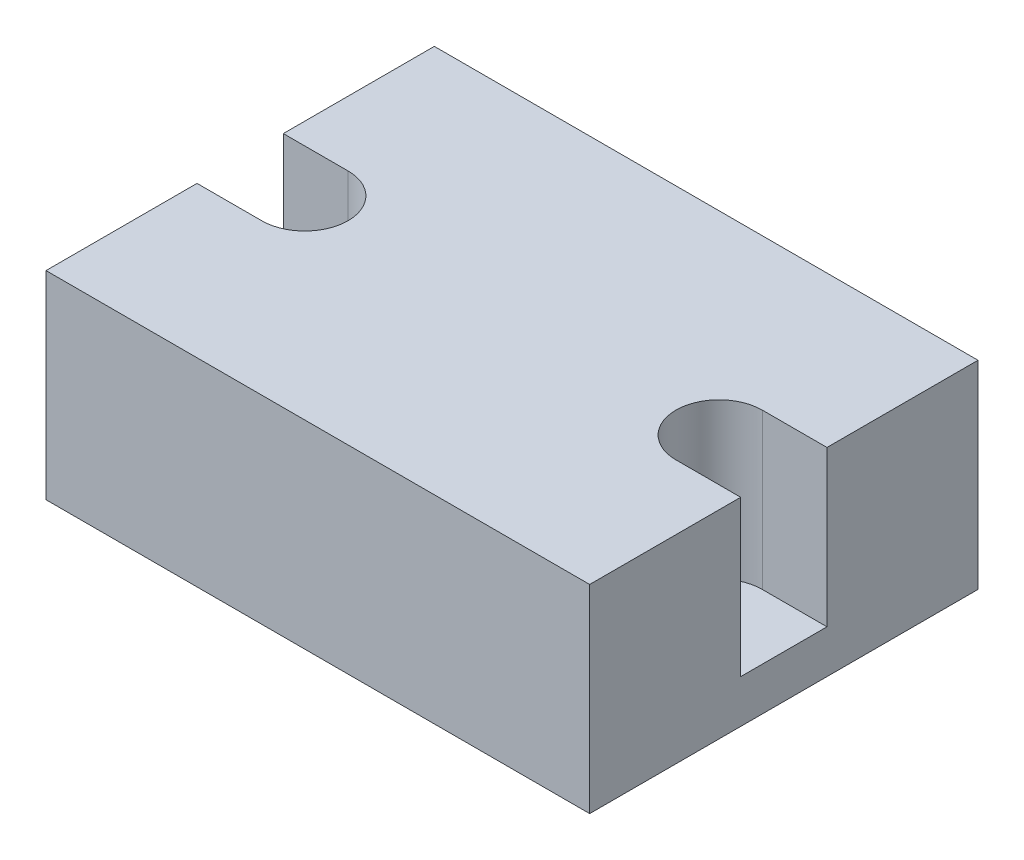
ISO-10303-21;
HEADER;
FILE_DESCRIPTION(('STEP AP214'),'2;1');
FILE_NAME('part.step','',(''),(''),'','','');
FILE_SCHEMA(('AUTOMOTIVE_DESIGN { 1 0 10303 214 1 1 1 1 }'));
ENDSEC;
DATA;
#1=APPLICATION_CONTEXT('core data for automotive mechanical design processes');
#2=APPLICATION_PROTOCOL_DEFINITION('international standard','automotive_design',2000,#1);
#3=PRODUCT_CONTEXT('',#1,'mechanical');
#4=PRODUCT('Part','Part','',(#3));
#5=PRODUCT_RELATED_PRODUCT_CATEGORY('part','',(#4));
#6=PRODUCT_DEFINITION_FORMATION('','',#4);
#7=PRODUCT_DEFINITION_CONTEXT('part definition',#1,'design');
#8=PRODUCT_DEFINITION('design','',#6,#7);
#9=PRODUCT_DEFINITION_SHAPE('','',#8);
#10=(LENGTH_UNIT() NAMED_UNIT(*) SI_UNIT(.MILLI.,.METRE.));
#11=(NAMED_UNIT(*) PLANE_ANGLE_UNIT() SI_UNIT($,.RADIAN.));
#12=(NAMED_UNIT(*) SI_UNIT($,.STERADIAN.) SOLID_ANGLE_UNIT());
#13=UNCERTAINTY_MEASURE_WITH_UNIT(LENGTH_MEASURE(1.E-05),#10,'distance_accuracy_value','');
#14=(GEOMETRIC_REPRESENTATION_CONTEXT(3) GLOBAL_UNCERTAINTY_ASSIGNED_CONTEXT((#13)) GLOBAL_UNIT_ASSIGNED_CONTEXT((#10,
#11,#12)) REPRESENTATION_CONTEXT('',''));
#15=CARTESIAN_POINT('',(0.,0.,0.));
#16=DIRECTION('',(0.,0.,1.));
#17=DIRECTION('',(1.,0.,0.));
#18=AXIS2_PLACEMENT_3D('',#15,#16,#17);
#19=CARTESIAN_POINT('',(31.5,23.,22.5));
#20=DIRECTION('',(-1.,0.,0.));
#21=DIRECTION('',(0.,0.,1.));
#22=AXIS2_PLACEMENT_3D('',#19,#20,#21);
#23=PLANE('',#22);
#24=DIRECTION('',(0.,0.,1.));
#25=VECTOR('',#24,1.);
#26=CARTESIAN_POINT('',(31.5,5.,22.5));
#27=LINE('',#26,#25);
#28=CARTESIAN_POINT('',(31.5,5.,-5.));
#29=VERTEX_POINT('',#28);
#30=CARTESIAN_POINT('',(31.5,5.,5.));
#31=VERTEX_POINT('',#30);
#32=EDGE_CURVE('E12',#29,#31,#27,.T.);
#33=ORIENTED_EDGE('',*,*,#32,.T.);
#34=DIRECTION('',(0.,1.,0.));
#35=VECTOR('',#34,1.);
#36=CARTESIAN_POINT('',(31.5,23.,5.));
#37=LINE('',#36,#35);
#38=CARTESIAN_POINT('',(31.5,23.,5.));
#39=VERTEX_POINT('',#38);
#40=EDGE_CURVE('E177',#31,#39,#37,.T.);
#41=ORIENTED_EDGE('',*,*,#40,.T.);
#42=DIRECTION('',(0.,0.,-1.));
#43=VECTOR('',#42,1.);
#44=CARTESIAN_POINT('',(31.5,23.,22.5));
#45=LINE('',#44,#43);
#46=CARTESIAN_POINT('',(31.5,23.,22.5));
#47=VERTEX_POINT('',#46);
#48=EDGE_CURVE('E147',#47,#39,#45,.T.);
#49=ORIENTED_EDGE('',*,*,#48,.F.);
#50=DIRECTION('',(0.,-1.,0.));
#51=VECTOR('',#50,1.);
#52=CARTESIAN_POINT('',(31.5,23.,22.5));
#53=LINE('',#52,#51);
#54=CARTESIAN_POINT('',(31.5,0.,22.5));
#55=VERTEX_POINT('',#54);
#56=EDGE_CURVE('E190',#47,#55,#53,.T.);
#57=ORIENTED_EDGE('',*,*,#56,.T.);
#58=DIRECTION('',(0.,0.,-1.));
#59=VECTOR('',#58,1.);
#60=CARTESIAN_POINT('',(31.5,0.,22.5));
#61=LINE('',#60,#59);
#62=CARTESIAN_POINT('',(31.5,0.,-22.5));
#63=VERTEX_POINT('',#62);
#64=EDGE_CURVE('E179',#55,#63,#61,.T.);
#65=ORIENTED_EDGE('',*,*,#64,.T.);
#66=DIRECTION('',(0.,-1.,0.));
#67=VECTOR('',#66,1.);
#68=CARTESIAN_POINT('',(31.5,23.,-22.5));
#69=LINE('',#68,#67);
#70=CARTESIAN_POINT('',(31.5,23.,-22.5));
#71=VERTEX_POINT('',#70);
#72=EDGE_CURVE('E207',#71,#63,#69,.T.);
#73=ORIENTED_EDGE('',*,*,#72,.F.);
#74=CARTESIAN_POINT('',(31.5,23.,-5.));
#75=VERTEX_POINT('',#74);
#76=EDGE_CURVE('E182',#75,#71,#45,.T.);
#77=ORIENTED_EDGE('',*,*,#76,.F.);
#78=DIRECTION('',(0.,-1.,0.));
#79=VECTOR('',#78,1.);
#80=CARTESIAN_POINT('',(31.5,23.,-5.));
#81=LINE('',#80,#79);
#82=EDGE_CURVE('E174',#75,#29,#81,.T.);
#83=ORIENTED_EDGE('',*,*,#82,.T.);
#84=EDGE_LOOP('',(#33,#41,#49,#57,#65,#73,#77,#83));
#85=FACE_BOUND('',#84,.T.);
#86=ADVANCED_FACE('F35',(#85),#23,.F.);
#87=CARTESIAN_POINT('',(-31.5,23.,-22.5));
#88=DIRECTION('',(0.,0.,1.));
#89=DIRECTION('',(1.,0.,0.));
#90=AXIS2_PLACEMENT_3D('',#87,#88,#89);
#91=PLANE('',#90);
#92=DIRECTION('',(-1.,0.,0.));
#93=VECTOR('',#92,1.);
#94=CARTESIAN_POINT('',(-31.5,0.,-22.5));
#95=LINE('',#94,#93);
#96=CARTESIAN_POINT('',(-31.5,0.,-22.5));
#97=VERTEX_POINT('',#96);
#98=EDGE_CURVE('E193',#63,#97,#95,.T.);
#99=ORIENTED_EDGE('',*,*,#98,.T.);
#100=DIRECTION('',(0.,-1.,0.));
#101=VECTOR('',#100,1.);
#102=CARTESIAN_POINT('',(-31.5,23.,-22.5));
#103=LINE('',#102,#101);
#104=CARTESIAN_POINT('',(-31.5,23.,-22.5));
#105=VERTEX_POINT('',#104);
#106=EDGE_CURVE('E204',#105,#97,#103,.T.);
#107=ORIENTED_EDGE('',*,*,#106,.F.);
#108=DIRECTION('',(-1.,0.,0.));
#109=VECTOR('',#108,1.);
#110=CARTESIAN_POINT('',(-31.5,23.,-22.5));
#111=LINE('',#110,#109);
#112=EDGE_CURVE('E181',#71,#105,#111,.T.);
#113=ORIENTED_EDGE('',*,*,#112,.F.);
#114=ORIENTED_EDGE('',*,*,#72,.T.);
#115=EDGE_LOOP('',(#99,#107,#113,#114));
#116=FACE_BOUND('',#115,.T.);
#117=ADVANCED_FACE('F240',(#116),#91,.F.);
#118=CARTESIAN_POINT('',(-31.5,23.,22.5));
#119=DIRECTION('',(1.,0.,0.));
#120=DIRECTION('',(0.,0.,-1.));
#121=AXIS2_PLACEMENT_3D('',#118,#119,#120);
#122=PLANE('',#121);
#123=DIRECTION('',(0.,0.,-1.));
#124=VECTOR('',#123,1.);
#125=CARTESIAN_POINT('',(-31.5,5.,22.5));
#126=LINE('',#125,#124);
#127=CARTESIAN_POINT('',(-31.5,5.,5.));
#128=VERTEX_POINT('',#127);
#129=CARTESIAN_POINT('',(-31.5,5.,-5.));
#130=VERTEX_POINT('',#129);
#131=EDGE_CURVE('E42',#128,#130,#126,.T.);
#132=ORIENTED_EDGE('',*,*,#131,.T.);
#133=DIRECTION('',(0.,1.,0.));
#134=VECTOR('',#133,1.);
#135=CARTESIAN_POINT('',(-31.5,23.,-5.));
#136=LINE('',#135,#134);
#137=CARTESIAN_POINT('',(-31.5,23.,-5.));
#138=VERTEX_POINT('',#137);
#139=EDGE_CURVE('E171',#130,#138,#136,.T.);
#140=ORIENTED_EDGE('',*,*,#139,.T.);
#141=DIRECTION('',(0.,0.,1.));
#142=VECTOR('',#141,1.);
#143=CARTESIAN_POINT('',(-31.5,23.,22.5));
#144=LINE('',#143,#142);
#145=EDGE_CURVE('E185',#105,#138,#144,.T.);
#146=ORIENTED_EDGE('',*,*,#145,.F.);
#147=ORIENTED_EDGE('',*,*,#106,.T.);
#148=DIRECTION('',(0.,0.,1.));
#149=VECTOR('',#148,1.);
#150=CARTESIAN_POINT('',(-31.5,0.,22.5));
#151=LINE('',#150,#149);
#152=CARTESIAN_POINT('',(-31.5,0.,22.5));
#153=VERTEX_POINT('',#152);
#154=EDGE_CURVE('E195',#97,#153,#151,.T.);
#155=ORIENTED_EDGE('',*,*,#154,.T.);
#156=DIRECTION('',(0.,-1.,0.));
#157=VECTOR('',#156,1.);
#158=CARTESIAN_POINT('',(-31.5,23.,22.5));
#159=LINE('',#158,#157);
#160=CARTESIAN_POINT('',(-31.5,23.,22.5));
#161=VERTEX_POINT('',#160);
#162=EDGE_CURVE('E201',#161,#153,#159,.T.);
#163=ORIENTED_EDGE('',*,*,#162,.F.);
#164=CARTESIAN_POINT('',(-31.5,23.,5.));
#165=VERTEX_POINT('',#164);
#166=EDGE_CURVE('E184',#165,#161,#144,.T.);
#167=ORIENTED_EDGE('',*,*,#166,.F.);
#168=DIRECTION('',(0.,-1.,0.));
#169=VECTOR('',#168,1.);
#170=CARTESIAN_POINT('',(-31.5,23.,5.));
#171=LINE('',#170,#169);
#172=EDGE_CURVE('E134',#165,#128,#171,.T.);
#173=ORIENTED_EDGE('',*,*,#172,.T.);
#174=EDGE_LOOP('',(#132,#140,#146,#147,#155,#163,#167,#173));
#175=FACE_BOUND('',#174,.T.);
#176=ADVANCED_FACE('F216',(#175),#122,.F.);
#177=CARTESIAN_POINT('',(-31.5,23.,22.5));
#178=DIRECTION('',(0.,0.,-1.));
#179=DIRECTION('',(-1.,0.,0.));
#180=AXIS2_PLACEMENT_3D('',#177,#178,#179);
#181=PLANE('',#180);
#182=DIRECTION('',(1.,0.,0.));
#183=VECTOR('',#182,1.);
#184=CARTESIAN_POINT('',(-31.5,0.,22.5));
#185=LINE('',#184,#183);
#186=EDGE_CURVE('E197',#153,#55,#185,.T.);
#187=ORIENTED_EDGE('',*,*,#186,.T.);
#188=ORIENTED_EDGE('',*,*,#56,.F.);
#189=DIRECTION('',(1.,0.,0.));
#190=VECTOR('',#189,1.);
#191=CARTESIAN_POINT('',(-31.5,23.,22.5));
#192=LINE('',#191,#190);
#193=EDGE_CURVE('E188',#161,#47,#192,.T.);
#194=ORIENTED_EDGE('',*,*,#193,.F.);
#195=ORIENTED_EDGE('',*,*,#162,.T.);
#196=EDGE_LOOP('',(#187,#188,#194,#195));
#197=FACE_BOUND('',#196,.T.);
#198=ADVANCED_FACE('F262',(#197),#181,.F.);
#199=CARTESIAN_POINT('',(0.,23.,0.));
#200=DIRECTION('',(0.,-1.,0.));
#201=DIRECTION('',(0.,0.,-1.));
#202=AXIS2_PLACEMENT_3D('',#199,#200,#201);
#203=PLANE('',#202);
#204=ORIENTED_EDGE('',*,*,#48,.T.);
#205=DIRECTION('',(1.,0.,0.));
#206=VECTOR('',#205,1.);
#207=CARTESIAN_POINT('',(24.,23.,5.));
#208=LINE('',#207,#206);
#209=CARTESIAN_POINT('',(24.,23.,5.));
#210=VERTEX_POINT('',#209);
#211=EDGE_CURVE('E129',#210,#39,#208,.T.);
#212=ORIENTED_EDGE('',*,*,#211,.F.);
#213=CARTESIAN_POINT('',(24.,23.,0.));
#214=DIRECTION('',(0.,1.,0.));
#215=DIRECTION('',(0.,0.,1.));
#216=AXIS2_PLACEMENT_3D('',#213,#214,#215);
#217=CIRCLE('',#216,5.);
#218=CARTESIAN_POINT('',(24.,23.,-5.));
#219=VERTEX_POINT('',#218);
#220=EDGE_CURVE('E138',#219,#210,#217,.T.);
#221=ORIENTED_EDGE('',*,*,#220,.F.);
#222=DIRECTION('',(1.,0.,0.));
#223=VECTOR('',#222,1.);
#224=CARTESIAN_POINT('',(0.,23.,-5.));
#225=LINE('',#224,#223);
#226=EDGE_CURVE('E213',#219,#75,#225,.T.);
#227=ORIENTED_EDGE('',*,*,#226,.T.);
#228=ORIENTED_EDGE('',*,*,#76,.T.);
#229=ORIENTED_EDGE('',*,*,#112,.T.);
#230=ORIENTED_EDGE('',*,*,#145,.T.);
#231=DIRECTION('',(-1.,0.,0.));
#232=VECTOR('',#231,1.);
#233=CARTESIAN_POINT('',(-24.,23.,-5.));
#234=LINE('',#233,#232);
#235=CARTESIAN_POINT('',(-24.,23.,-5.));
#236=VERTEX_POINT('',#235);
#237=EDGE_CURVE('E155',#236,#138,#234,.T.);
#238=ORIENTED_EDGE('',*,*,#237,.F.);
#239=CARTESIAN_POINT('',(-24.,23.,0.));
#240=DIRECTION('',(0.,1.,0.));
#241=DIRECTION('',(0.,0.,-1.));
#242=AXIS2_PLACEMENT_3D('',#239,#240,#241);
#243=CIRCLE('',#242,5.);
#244=CARTESIAN_POINT('',(-24.,23.,5.));
#245=VERTEX_POINT('',#244);
#246=EDGE_CURVE('E158',#245,#236,#243,.T.);
#247=ORIENTED_EDGE('',*,*,#246,.F.);
#248=DIRECTION('',(-1.,0.,0.));
#249=VECTOR('',#248,1.);
#250=CARTESIAN_POINT('',(0.,23.,5.));
#251=LINE('',#250,#249);
#252=EDGE_CURVE('E210',#245,#165,#251,.T.);
#253=ORIENTED_EDGE('',*,*,#252,.T.);
#254=ORIENTED_EDGE('',*,*,#166,.T.);
#255=ORIENTED_EDGE('',*,*,#193,.T.);
#256=EDGE_LOOP('',(#204,#212,#221,#227,#228,#229,#230,#238,#247,#253,#254,#255));
#257=FACE_BOUND('',#256,.T.);
#258=ADVANCED_FACE('F145',(#257),#203,.F.);
#259=CARTESIAN_POINT('',(0.,0.,0.));
#260=DIRECTION('',(0.,-1.,0.));
#261=DIRECTION('',(0.,0.,-1.));
#262=AXIS2_PLACEMENT_3D('',#259,#260,#261);
#263=PLANE('',#262);
#264=ORIENTED_EDGE('',*,*,#64,.F.);
#265=ORIENTED_EDGE('',*,*,#186,.F.);
#266=ORIENTED_EDGE('',*,*,#154,.F.);
#267=ORIENTED_EDGE('',*,*,#98,.F.);
#268=EDGE_LOOP('',(#264,#265,#266,#267));
#269=FACE_BOUND('',#268,.T.);
#270=ADVANCED_FACE('F237',(#269),#263,.T.);
#271=CARTESIAN_POINT('',(0.,5.,0.));
#272=DIRECTION('',(0.,-1.,0.));
#273=DIRECTION('',(0.,0.,-1.));
#274=AXIS2_PLACEMENT_3D('',#271,#272,#273);
#275=PLANE('',#274);
#276=DIRECTION('',(1.,0.,0.));
#277=VECTOR('',#276,1.);
#278=CARTESIAN_POINT('',(-24.,5.,5.));
#279=LINE('',#278,#277);
#280=CARTESIAN_POINT('',(-24.,5.,5.));
#281=VERTEX_POINT('',#280);
#282=EDGE_CURVE('E162',#128,#281,#279,.T.);
#283=ORIENTED_EDGE('',*,*,#282,.T.);
#284=CARTESIAN_POINT('',(-24.,5.,0.));
#285=DIRECTION('',(0.,-1.,0.));
#286=DIRECTION('',(0.,0.,-1.));
#287=AXIS2_PLACEMENT_3D('',#284,#285,#286);
#288=CIRCLE('',#287,5.);
#289=CARTESIAN_POINT('',(-24.,5.,-5.));
#290=VERTEX_POINT('',#289);
#291=EDGE_CURVE('E163',#281,#290,#288,.F.);
#292=ORIENTED_EDGE('',*,*,#291,.T.);
#293=DIRECTION('',(-1.,0.,0.));
#294=VECTOR('',#293,1.);
#295=CARTESIAN_POINT('',(-24.,5.,-5.));
#296=LINE('',#295,#294);
#297=EDGE_CURVE('E157',#290,#130,#296,.T.);
#298=ORIENTED_EDGE('',*,*,#297,.T.);
#299=ORIENTED_EDGE('',*,*,#131,.F.);
#300=EDGE_LOOP('',(#283,#292,#298,#299));
#301=FACE_BOUND('',#300,.T.);
#302=ADVANCED_FACE('F221',(#301),#275,.F.);
#303=CARTESIAN_POINT('',(-24.,-26.8859015508835,-5.));
#304=DIRECTION('',(0.,0.,-1.));
#305=DIRECTION('',(-1.,0.,0.));
#306=AXIS2_PLACEMENT_3D('',#303,#304,#305);
#307=PLANE('',#306);
#308=ORIENTED_EDGE('',*,*,#297,.F.);
#309=DIRECTION('',(0.,1.,0.));
#310=VECTOR('',#309,1.);
#311=CARTESIAN_POINT('',(-24.,-26.8859015508835,-5.));
#312=LINE('',#311,#310);
#313=EDGE_CURVE('E142',#290,#236,#312,.T.);
#314=ORIENTED_EDGE('',*,*,#313,.T.);
#315=ORIENTED_EDGE('',*,*,#237,.T.);
#316=ORIENTED_EDGE('',*,*,#139,.F.);
#317=EDGE_LOOP('',(#308,#314,#315,#316));
#318=FACE_BOUND('',#317,.T.);
#319=ADVANCED_FACE('F229',(#318),#307,.F.);
#320=CARTESIAN_POINT('',(-24.,-26.8859015508835,5.));
#321=DIRECTION('',(0.,0.,1.));
#322=DIRECTION('',(1.,0.,0.));
#323=AXIS2_PLACEMENT_3D('',#320,#321,#322);
#324=PLANE('',#323);
#325=ORIENTED_EDGE('',*,*,#252,.F.);
#326=DIRECTION('',(0.,1.,0.));
#327=VECTOR('',#326,1.);
#328=CARTESIAN_POINT('',(-24.,-26.8859015508835,5.));
#329=LINE('',#328,#327);
#330=EDGE_CURVE('E57',#281,#245,#329,.T.);
#331=ORIENTED_EDGE('',*,*,#330,.F.);
#332=ORIENTED_EDGE('',*,*,#282,.F.);
#333=ORIENTED_EDGE('',*,*,#172,.F.);
#334=EDGE_LOOP('',(#325,#331,#332,#333));
#335=FACE_BOUND('',#334,.T.);
#336=ADVANCED_FACE('F223',(#335),#324,.F.);
#337=CARTESIAN_POINT('',(-24.,-26.8859015508835,0.));
#338=DIRECTION('',(0.,1.,0.));
#339=DIRECTION('',(0.,0.,1.));
#340=AXIS2_PLACEMENT_3D('',#337,#338,#339);
#341=CYLINDRICAL_SURFACE('',#340,5.);
#342=ORIENTED_EDGE('',*,*,#330,.T.);
#343=ORIENTED_EDGE('',*,*,#246,.T.);
#344=ORIENTED_EDGE('',*,*,#313,.F.);
#345=ORIENTED_EDGE('',*,*,#291,.F.);
#346=EDGE_LOOP('',(#342,#343,#344,#345));
#347=FACE_BOUND('',#346,.T.);
#348=ADVANCED_FACE('F227',(#347),#341,.F.);
#349=CARTESIAN_POINT('',(0.,5.,0.));
#350=DIRECTION('',(0.,-1.,0.));
#351=DIRECTION('',(0.,0.,-1.));
#352=AXIS2_PLACEMENT_3D('',#349,#350,#351);
#353=PLANE('',#352);
#354=DIRECTION('',(-1.,0.,0.));
#355=VECTOR('',#354,1.);
#356=CARTESIAN_POINT('',(24.,5.,-5.));
#357=LINE('',#356,#355);
#358=CARTESIAN_POINT('',(24.,5.,-5.));
#359=VERTEX_POINT('',#358);
#360=EDGE_CURVE('E149',#29,#359,#357,.T.);
#361=ORIENTED_EDGE('',*,*,#360,.T.);
#362=CARTESIAN_POINT('',(24.,5.,0.));
#363=DIRECTION('',(0.,-1.,0.));
#364=DIRECTION('',(0.,0.,-1.));
#365=AXIS2_PLACEMENT_3D('',#362,#363,#364);
#366=CIRCLE('',#365,5.);
#367=CARTESIAN_POINT('',(24.,5.,5.));
#368=VERTEX_POINT('',#367);
#369=EDGE_CURVE('E135',#359,#368,#366,.F.);
#370=ORIENTED_EDGE('',*,*,#369,.T.);
#371=DIRECTION('',(1.,0.,0.));
#372=VECTOR('',#371,1.);
#373=CARTESIAN_POINT('',(24.,5.,5.));
#374=LINE('',#373,#372);
#375=EDGE_CURVE('E132',#368,#31,#374,.T.);
#376=ORIENTED_EDGE('',*,*,#375,.T.);
#377=ORIENTED_EDGE('',*,*,#32,.F.);
#378=EDGE_LOOP('',(#361,#370,#376,#377));
#379=FACE_BOUND('',#378,.T.);
#380=ADVANCED_FACE('F249',(#379),#353,.F.);
#381=CARTESIAN_POINT('',(24.,-26.8859015508835,5.));
#382=DIRECTION('',(0.,0.,1.));
#383=DIRECTION('',(1.,0.,0.));
#384=AXIS2_PLACEMENT_3D('',#381,#382,#383);
#385=PLANE('',#384);
#386=ORIENTED_EDGE('',*,*,#375,.F.);
#387=DIRECTION('',(0.,1.,0.));
#388=VECTOR('',#387,1.);
#389=CARTESIAN_POINT('',(24.,-26.8859015508835,5.));
#390=LINE('',#389,#388);
#391=EDGE_CURVE('E126',#368,#210,#390,.T.);
#392=ORIENTED_EDGE('',*,*,#391,.T.);
#393=ORIENTED_EDGE('',*,*,#211,.T.);
#394=ORIENTED_EDGE('',*,*,#40,.F.);
#395=EDGE_LOOP('',(#386,#392,#393,#394));
#396=FACE_BOUND('',#395,.T.);
#397=ADVANCED_FACE('F127',(#396),#385,.F.);
#398=CARTESIAN_POINT('',(24.,-26.8859015508835,-5.));
#399=DIRECTION('',(0.,0.,-1.));
#400=DIRECTION('',(-1.,0.,0.));
#401=AXIS2_PLACEMENT_3D('',#398,#399,#400);
#402=PLANE('',#401);
#403=ORIENTED_EDGE('',*,*,#226,.F.);
#404=DIRECTION('',(0.,1.,0.));
#405=VECTOR('',#404,1.);
#406=CARTESIAN_POINT('',(24.,-26.8859015508835,-5.));
#407=LINE('',#406,#405);
#408=EDGE_CURVE('E49',#359,#219,#407,.T.);
#409=ORIENTED_EDGE('',*,*,#408,.F.);
#410=ORIENTED_EDGE('',*,*,#360,.F.);
#411=ORIENTED_EDGE('',*,*,#82,.F.);
#412=EDGE_LOOP('',(#403,#409,#410,#411));
#413=FACE_BOUND('',#412,.T.);
#414=ADVANCED_FACE('F251',(#413),#402,.F.);
#415=CARTESIAN_POINT('',(24.,-26.8859015508835,0.));
#416=DIRECTION('',(0.,1.,0.));
#417=DIRECTION('',(0.,0.,1.));
#418=AXIS2_PLACEMENT_3D('',#415,#416,#417);
#419=CYLINDRICAL_SURFACE('',#418,5.);
#420=ORIENTED_EDGE('',*,*,#408,.T.);
#421=ORIENTED_EDGE('',*,*,#220,.T.);
#422=ORIENTED_EDGE('',*,*,#391,.F.);
#423=ORIENTED_EDGE('',*,*,#369,.F.);
#424=EDGE_LOOP('',(#420,#421,#422,#423));
#425=FACE_BOUND('',#424,.T.);
#426=ADVANCED_FACE('F139',(#425),#419,.F.);
#427=CLOSED_SHELL('',(#86,#117,#176,#198,#258,#270,#302,#319,#336,#348,#380,#397,#414,#426));
#428=MANIFOLD_SOLID_BREP('B2',#427);
#429=ADVANCED_BREP_SHAPE_REPRESENTATION('',(#18,#428),#14);
#430=SHAPE_DEFINITION_REPRESENTATION(#9,#429);
ENDSEC;
END-ISO-10303-21;
